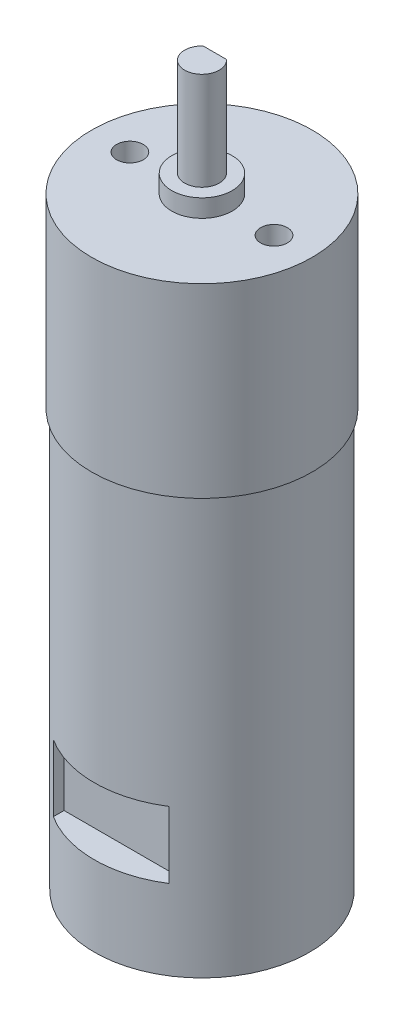
ISO-10303-21;
HEADER;
FILE_DESCRIPTION(('STEP AP214'),'2;1');
FILE_NAME('part.step','',(''),(''),'','','');
FILE_SCHEMA(('AUTOMOTIVE_DESIGN { 1 0 10303 214 1 1 1 1 }'));
ENDSEC;
DATA;
#1=APPLICATION_CONTEXT('core data for automotive mechanical design processes');
#2=APPLICATION_PROTOCOL_DEFINITION('international standard','automotive_design',2000,#1);
#3=PRODUCT_CONTEXT('',#1,'mechanical');
#4=PRODUCT('Part','Part','',(#3));
#5=PRODUCT_RELATED_PRODUCT_CATEGORY('part','',(#4));
#6=PRODUCT_DEFINITION_FORMATION('','',#4);
#7=PRODUCT_DEFINITION_CONTEXT('part definition',#1,'design');
#8=PRODUCT_DEFINITION('design','',#6,#7);
#9=PRODUCT_DEFINITION_SHAPE('','',#8);
#10=(LENGTH_UNIT() NAMED_UNIT(*) SI_UNIT(.MILLI.,.METRE.));
#11=(NAMED_UNIT(*) PLANE_ANGLE_UNIT() SI_UNIT($,.RADIAN.));
#12=(NAMED_UNIT(*) SI_UNIT($,.STERADIAN.) SOLID_ANGLE_UNIT());
#13=UNCERTAINTY_MEASURE_WITH_UNIT(LENGTH_MEASURE(1.E-05),#10,'distance_accuracy_value','');
#14=(GEOMETRIC_REPRESENTATION_CONTEXT(3) GLOBAL_UNCERTAINTY_ASSIGNED_CONTEXT((#13)) GLOBAL_UNIT_ASSIGNED_CONTEXT((#10,
#11,#12)) REPRESENTATION_CONTEXT('',''));
#15=CARTESIAN_POINT('',(0.,0.,0.));
#16=DIRECTION('',(0.,0.,1.));
#17=DIRECTION('',(1.,0.,0.));
#18=AXIS2_PLACEMENT_3D('',#15,#16,#17);
#19=CARTESIAN_POINT('',(0.,20.9,0.));
#20=DIRECTION('',(0.,-1.,0.));
#21=DIRECTION('',(0.,0.,-1.));
#22=AXIS2_PLACEMENT_3D('',#19,#20,#21);
#23=CYLINDRICAL_SURFACE('',#22,12.4);
#24=CARTESIAN_POINT('',(0.,20.9,0.));
#25=DIRECTION('',(0.,1.,0.));
#26=DIRECTION('',(0.,0.,1.));
#27=AXIS2_PLACEMENT_3D('',#24,#25,#26);
#28=CIRCLE('',#27,12.4);
#29=CARTESIAN_POINT('',(0.,20.9,12.4));
#30=VERTEX_POINT('',#29);
#31=EDGE_CURVE('E187',#30,#30,#28,.T.);
#32=ORIENTED_EDGE('',*,*,#31,.F.);
#33=EDGE_LOOP('',(#32));
#34=FACE_BOUND('',#33,.T.);
#35=CARTESIAN_POINT('',(0.,0.,0.));
#36=DIRECTION('',(0.,1.,0.));
#37=DIRECTION('',(0.,0.,1.));
#38=AXIS2_PLACEMENT_3D('',#35,#36,#37);
#39=CIRCLE('',#38,12.4);
#40=CARTESIAN_POINT('',(0.,0.,12.4));
#41=VERTEX_POINT('',#40);
#42=EDGE_CURVE('E183',#41,#41,#39,.T.);
#43=ORIENTED_EDGE('',*,*,#42,.T.);
#44=EDGE_LOOP('',(#43));
#45=FACE_BOUND('',#44,.T.);
#46=ADVANCED_FACE('F42',(#34,#45),#23,.T.);
#47=CARTESIAN_POINT('',(0.,20.9,0.));
#48=DIRECTION('',(0.,1.,0.));
#49=DIRECTION('',(0.,0.,1.));
#50=AXIS2_PLACEMENT_3D('',#47,#48,#49);
#51=PLANE('',#50);
#52=CARTESIAN_POINT('',(-8.1,20.9,0.));
#53=DIRECTION('',(0.,1.,0.));
#54=DIRECTION('',(0.,0.,1.));
#55=AXIS2_PLACEMENT_3D('',#52,#53,#54);
#56=CIRCLE('',#55,1.5);
#57=CARTESIAN_POINT('',(-8.1,20.9,1.5));
#58=VERTEX_POINT('',#57);
#59=EDGE_CURVE('E139',#58,#58,#56,.T.);
#60=ORIENTED_EDGE('',*,*,#59,.F.);
#61=EDGE_LOOP('',(#60));
#62=FACE_BOUND('',#61,.T.);
#63=CARTESIAN_POINT('',(8.1,20.9,0.));
#64=DIRECTION('',(0.,1.,0.));
#65=DIRECTION('',(0.,0.,-1.));
#66=AXIS2_PLACEMENT_3D('',#63,#64,#65);
#67=CIRCLE('',#66,1.5);
#68=CARTESIAN_POINT('',(8.1,20.9,-1.5));
#69=VERTEX_POINT('',#68);
#70=EDGE_CURVE('E143',#69,#69,#67,.T.);
#71=ORIENTED_EDGE('',*,*,#70,.F.);
#72=EDGE_LOOP('',(#71));
#73=FACE_BOUND('',#72,.T.);
#74=CARTESIAN_POINT('',(0.,20.9,0.));
#75=DIRECTION('',(0.,1.,0.));
#76=DIRECTION('',(0.,0.,1.));
#77=AXIS2_PLACEMENT_3D('',#74,#75,#76);
#78=CIRCLE('',#77,3.4);
#79=CARTESIAN_POINT('',(0.,20.9,3.4));
#80=VERTEX_POINT('',#79);
#81=EDGE_CURVE('E179',#80,#80,#78,.T.);
#82=ORIENTED_EDGE('',*,*,#81,.F.);
#83=EDGE_LOOP('',(#82));
#84=FACE_BOUND('',#83,.T.);
#85=ORIENTED_EDGE('',*,*,#31,.T.);
#86=EDGE_LOOP('',(#85));
#87=FACE_BOUND('',#86,.T.);
#88=ADVANCED_FACE('F222',(#62,#73,#84,#87),#51,.T.);
#89=CARTESIAN_POINT('',(0.,0.,0.));
#90=DIRECTION('',(0.,1.,0.));
#91=DIRECTION('',(0.,0.,1.));
#92=AXIS2_PLACEMENT_3D('',#89,#90,#91);
#93=PLANE('',#92);
#94=CARTESIAN_POINT('',(0.,0.,0.));
#95=DIRECTION('',(0.,-1.,0.));
#96=DIRECTION('',(0.,0.,-1.));
#97=AXIS2_PLACEMENT_3D('',#94,#95,#96);
#98=CIRCLE('',#97,12.1);
#99=CARTESIAN_POINT('',(0.,0.,-12.1));
#100=VERTEX_POINT('',#99);
#101=EDGE_CURVE('E154',#100,#100,#98,.T.);
#102=ORIENTED_EDGE('',*,*,#101,.F.);
#103=EDGE_LOOP('',(#102));
#104=FACE_BOUND('',#103,.T.);
#105=ORIENTED_EDGE('',*,*,#42,.F.);
#106=EDGE_LOOP('',(#105));
#107=FACE_BOUND('',#106,.T.);
#108=ADVANCED_FACE('F228',(#104,#107),#93,.F.);
#109=CARTESIAN_POINT('',(0.,22.9,0.));
#110=DIRECTION('',(0.,-1.,0.));
#111=DIRECTION('',(0.,0.,-1.));
#112=AXIS2_PLACEMENT_3D('',#109,#110,#111);
#113=CYLINDRICAL_SURFACE('',#112,3.4);
#114=CARTESIAN_POINT('',(0.,22.9,0.));
#115=DIRECTION('',(0.,1.,0.));
#116=DIRECTION('',(0.,0.,1.));
#117=AXIS2_PLACEMENT_3D('',#114,#115,#116);
#118=CIRCLE('',#117,3.4);
#119=CARTESIAN_POINT('',(0.,22.9,3.4));
#120=VERTEX_POINT('',#119);
#121=EDGE_CURVE('E173',#120,#120,#118,.T.);
#122=ORIENTED_EDGE('',*,*,#121,.F.);
#123=EDGE_LOOP('',(#122));
#124=FACE_BOUND('',#123,.T.);
#125=ORIENTED_EDGE('',*,*,#81,.T.);
#126=EDGE_LOOP('',(#125));
#127=FACE_BOUND('',#126,.T.);
#128=ADVANCED_FACE('F236',(#124,#127),#113,.T.);
#129=CARTESIAN_POINT('',(0.,22.9,0.));
#130=DIRECTION('',(0.,1.,0.));
#131=DIRECTION('',(0.,0.,1.));
#132=AXIS2_PLACEMENT_3D('',#129,#130,#131);
#133=PLANE('',#132);
#134=CARTESIAN_POINT('',(0.,22.9,0.));
#135=DIRECTION('',(0.,1.,0.));
#136=DIRECTION('',(0.,0.,1.));
#137=AXIS2_PLACEMENT_3D('',#134,#135,#136);
#138=CIRCLE('',#137,1.95);
#139=CARTESIAN_POINT('',(0.,22.9,1.95));
#140=VERTEX_POINT('',#139);
#141=EDGE_CURVE('E174',#140,#140,#138,.T.);
#142=ORIENTED_EDGE('',*,*,#141,.F.);
#143=EDGE_LOOP('',(#142));
#144=FACE_BOUND('',#143,.T.);
#145=ORIENTED_EDGE('',*,*,#121,.T.);
#146=EDGE_LOOP('',(#145));
#147=FACE_BOUND('',#146,.T.);
#148=ADVANCED_FACE('F241',(#144,#147),#133,.T.);
#149=CARTESIAN_POINT('',(0.,33.9,0.));
#150=DIRECTION('',(0.,-1.,0.));
#151=DIRECTION('',(0.,0.,-1.));
#152=AXIS2_PLACEMENT_3D('',#149,#150,#151);
#153=CYLINDRICAL_SURFACE('',#152,1.95);
#154=CARTESIAN_POINT('',(0.,33.9,0.));
#155=DIRECTION('',(0.,1.,0.));
#156=DIRECTION('',(0.,0.,1.));
#157=AXIS2_PLACEMENT_3D('',#154,#155,#156);
#158=CIRCLE('',#157,1.95);
#159=CARTESIAN_POINT('',(-1.30384048104053,33.9,-1.45));
#160=VERTEX_POINT('',#159);
#161=CARTESIAN_POINT('',(1.30384048104053,33.9,-1.45));
#162=VERTEX_POINT('',#161);
#163=EDGE_CURVE('E169',#160,#162,#158,.T.);
#164=ORIENTED_EDGE('',*,*,#163,.F.);
#165=DIRECTION('',(0.,-1.,0.));
#166=VECTOR('',#165,1.);
#167=CARTESIAN_POINT('',(-1.30384048104053,33.9,-1.45));
#168=LINE('',#167,#166);
#169=CARTESIAN_POINT('',(-1.30384048104053,23.9,-1.45));
#170=VERTEX_POINT('',#169);
#171=EDGE_CURVE('E65',#160,#170,#168,.T.);
#172=ORIENTED_EDGE('',*,*,#171,.T.);
#173=CARTESIAN_POINT('',(0.,23.9,0.));
#174=DIRECTION('',(0.,-1.,0.));
#175=DIRECTION('',(0.,0.,-1.));
#176=AXIS2_PLACEMENT_3D('',#173,#174,#175);
#177=CIRCLE('',#176,1.95);
#178=CARTESIAN_POINT('',(1.30384048104053,23.9,-1.45));
#179=VERTEX_POINT('',#178);
#180=EDGE_CURVE('E159',#170,#179,#177,.T.);
#181=ORIENTED_EDGE('',*,*,#180,.T.);
#182=DIRECTION('',(0.,-1.,0.));
#183=VECTOR('',#182,1.);
#184=CARTESIAN_POINT('',(1.30384048104053,33.9,-1.45));
#185=LINE('',#184,#183);
#186=EDGE_CURVE('E163',#179,#162,#185,.F.);
#187=ORIENTED_EDGE('',*,*,#186,.T.);
#188=EDGE_LOOP('',(#164,#172,#181,#187));
#189=FACE_BOUND('',#188,.T.);
#190=ORIENTED_EDGE('',*,*,#141,.T.);
#191=EDGE_LOOP('',(#190));
#192=FACE_BOUND('',#191,.T.);
#193=ADVANCED_FACE('F248',(#189,#192),#153,.T.);
#194=CARTESIAN_POINT('',(0.,33.9,0.));
#195=DIRECTION('',(0.,1.,0.));
#196=DIRECTION('',(0.,0.,1.));
#197=AXIS2_PLACEMENT_3D('',#194,#195,#196);
#198=PLANE('',#197);
#199=DIRECTION('',(1.,0.,0.));
#200=VECTOR('',#199,1.);
#201=CARTESIAN_POINT('',(0.,33.9,-1.45));
#202=LINE('',#201,#200);
#203=EDGE_CURVE('E178',#160,#162,#202,.T.);
#204=ORIENTED_EDGE('',*,*,#203,.F.);
#205=ORIENTED_EDGE('',*,*,#163,.T.);
#206=EDGE_LOOP('',(#204,#205));
#207=FACE_BOUND('',#206,.T.);
#208=ADVANCED_FACE('F252',(#207),#198,.T.);
#209=CARTESIAN_POINT('',(0.,23.9,0.));
#210=DIRECTION('',(0.,-1.,0.));
#211=DIRECTION('',(0.,0.,-1.));
#212=AXIS2_PLACEMENT_3D('',#209,#210,#211);
#213=PLANE('',#212);
#214=DIRECTION('',(1.,0.,0.));
#215=VECTOR('',#214,1.);
#216=CARTESIAN_POINT('',(1.84486384252448,23.9,-1.45));
#217=LINE('',#216,#215);
#218=EDGE_CURVE('E153',#170,#179,#217,.T.);
#219=ORIENTED_EDGE('',*,*,#218,.T.);
#220=ORIENTED_EDGE('',*,*,#180,.F.);
#221=EDGE_LOOP('',(#219,#220));
#222=FACE_BOUND('',#221,.T.);
#223=ADVANCED_FACE('F256',(#222),#213,.F.);
#224=CARTESIAN_POINT('',(0.,23.9,-1.45));
#225=DIRECTION('',(0.,0.,1.));
#226=DIRECTION('',(1.,0.,0.));
#227=AXIS2_PLACEMENT_3D('',#224,#225,#226);
#228=PLANE('',#227);
#229=ORIENTED_EDGE('',*,*,#203,.T.);
#230=ORIENTED_EDGE('',*,*,#186,.F.);
#231=ORIENTED_EDGE('',*,*,#218,.F.);
#232=ORIENTED_EDGE('',*,*,#171,.F.);
#233=EDGE_LOOP('',(#229,#230,#231,#232));
#234=FACE_BOUND('',#233,.T.);
#235=ADVANCED_FACE('F258',(#234),#228,.F.);
#236=CARTESIAN_POINT('',(0.,-46.9,0.));
#237=DIRECTION('',(0.,1.,0.));
#238=DIRECTION('',(0.,0.,1.));
#239=AXIS2_PLACEMENT_3D('',#236,#237,#238);
#240=CYLINDRICAL_SURFACE('',#239,12.1);
#241=CARTESIAN_POINT('',(0.,-37.9,0.));
#242=DIRECTION('',(0.,-1.,0.));
#243=DIRECTION('',(0.,0.,-1.));
#244=AXIS2_PLACEMENT_3D('',#241,#242,#243);
#245=CIRCLE('',#244,12.1);
#246=CARTESIAN_POINT('',(6.5,-37.9,10.2058806577385));
#247=VERTEX_POINT('',#246);
#248=CARTESIAN_POINT('',(-6.5,-37.9,10.2058806577385));
#249=VERTEX_POINT('',#248);
#250=EDGE_CURVE('E158',#247,#249,#245,.T.);
#251=ORIENTED_EDGE('',*,*,#250,.T.);
#252=DIRECTION('',(0.,1.,0.));
#253=VECTOR('',#252,1.);
#254=CARTESIAN_POINT('',(-6.5,-46.9,10.2058806577385));
#255=LINE('',#254,#253);
#256=CARTESIAN_POINT('',(-6.5,-30.4,10.2058806577385));
#257=VERTEX_POINT('',#256);
#258=EDGE_CURVE('E11',#249,#257,#255,.T.);
#259=ORIENTED_EDGE('',*,*,#258,.T.);
#260=CARTESIAN_POINT('',(0.,-30.4,0.));
#261=DIRECTION('',(0.,1.,0.));
#262=DIRECTION('',(0.,0.,1.));
#263=AXIS2_PLACEMENT_3D('',#260,#261,#262);
#264=CIRCLE('',#263,12.1);
#265=CARTESIAN_POINT('',(6.5,-30.4,10.2058806577385));
#266=VERTEX_POINT('',#265);
#267=EDGE_CURVE('E50',#257,#266,#264,.T.);
#268=ORIENTED_EDGE('',*,*,#267,.T.);
#269=DIRECTION('',(0.,1.,0.));
#270=VECTOR('',#269,1.);
#271=CARTESIAN_POINT('',(6.5,-46.9,10.2058806577385));
#272=LINE('',#271,#270);
#273=EDGE_CURVE('E201',#266,#247,#272,.F.);
#274=ORIENTED_EDGE('',*,*,#273,.T.);
#275=EDGE_LOOP('',(#251,#259,#268,#274));
#276=FACE_BOUND('',#275,.T.);
#277=CARTESIAN_POINT('',(0.,-46.9,0.));
#278=DIRECTION('',(0.,-1.,0.));
#279=DIRECTION('',(0.,0.,-1.));
#280=AXIS2_PLACEMENT_3D('',#277,#278,#279);
#281=CIRCLE('',#280,12.1);
#282=CARTESIAN_POINT('',(0.,-46.9,-12.1));
#283=VERTEX_POINT('',#282);
#284=EDGE_CURVE('E138',#283,#283,#281,.T.);
#285=ORIENTED_EDGE('',*,*,#284,.F.);
#286=EDGE_LOOP('',(#285));
#287=FACE_BOUND('',#286,.T.);
#288=ORIENTED_EDGE('',*,*,#101,.T.);
#289=EDGE_LOOP('',(#288));
#290=FACE_BOUND('',#289,.T.);
#291=ADVANCED_FACE('F207',(#276,#287,#290),#240,.T.);
#292=CARTESIAN_POINT('',(0.,-46.9,0.));
#293=DIRECTION('',(0.,-1.,0.));
#294=DIRECTION('',(0.,0.,-1.));
#295=AXIS2_PLACEMENT_3D('',#292,#293,#294);
#296=PLANE('',#295);
#297=ORIENTED_EDGE('',*,*,#284,.T.);
#298=EDGE_LOOP('',(#297));
#299=FACE_BOUND('',#298,.T.);
#300=ADVANCED_FACE('F266',(#299),#296,.T.);
#301=CARTESIAN_POINT('',(8.1,15.9,0.));
#302=DIRECTION('',(0.,1.,0.));
#303=DIRECTION('',(0.,0.,1.));
#304=AXIS2_PLACEMENT_3D('',#301,#302,#303);
#305=CYLINDRICAL_SURFACE('',#304,1.5);
#306=CARTESIAN_POINT('',(8.1,15.9,0.));
#307=DIRECTION('',(0.,1.,0.));
#308=DIRECTION('',(0.,0.,-1.));
#309=AXIS2_PLACEMENT_3D('',#306,#307,#308);
#310=CIRCLE('',#309,1.5);
#311=CARTESIAN_POINT('',(8.1,15.9,-1.5));
#312=VERTEX_POINT('',#311);
#313=EDGE_CURVE('E127',#312,#312,#310,.T.);
#314=ORIENTED_EDGE('',*,*,#313,.F.);
#315=EDGE_LOOP('',(#314));
#316=FACE_BOUND('',#315,.T.);
#317=ORIENTED_EDGE('',*,*,#70,.T.);
#318=EDGE_LOOP('',(#317));
#319=FACE_BOUND('',#318,.T.);
#320=ADVANCED_FACE('F269',(#316,#319),#305,.F.);
#321=CARTESIAN_POINT('',(8.1,15.9,0.));
#322=DIRECTION('',(0.,-1.,0.));
#323=DIRECTION('',(0.,0.,-1.));
#324=AXIS2_PLACEMENT_3D('',#321,#322,#323);
#325=PLANE('',#324);
#326=ORIENTED_EDGE('',*,*,#313,.T.);
#327=EDGE_LOOP('',(#326));
#328=FACE_BOUND('',#327,.T.);
#329=ADVANCED_FACE('F271',(#328),#325,.F.);
#330=CARTESIAN_POINT('',(-8.1,15.9,0.));
#331=DIRECTION('',(0.,1.,0.));
#332=DIRECTION('',(0.,0.,1.));
#333=AXIS2_PLACEMENT_3D('',#330,#331,#332);
#334=CYLINDRICAL_SURFACE('',#333,1.5);
#335=CARTESIAN_POINT('',(-8.1,15.9,0.));
#336=DIRECTION('',(0.,1.,0.));
#337=DIRECTION('',(0.,0.,1.));
#338=AXIS2_PLACEMENT_3D('',#335,#336,#337);
#339=CIRCLE('',#338,1.5);
#340=CARTESIAN_POINT('',(-8.1,15.9,1.5));
#341=VERTEX_POINT('',#340);
#342=EDGE_CURVE('E134',#341,#341,#339,.T.);
#343=ORIENTED_EDGE('',*,*,#342,.F.);
#344=EDGE_LOOP('',(#343));
#345=FACE_BOUND('',#344,.T.);
#346=ORIENTED_EDGE('',*,*,#59,.T.);
#347=EDGE_LOOP('',(#346));
#348=FACE_BOUND('',#347,.T.);
#349=ADVANCED_FACE('F274',(#345,#348),#334,.F.);
#350=CARTESIAN_POINT('',(-8.1,15.9,0.));
#351=DIRECTION('',(0.,1.,0.));
#352=DIRECTION('',(0.,0.,1.));
#353=AXIS2_PLACEMENT_3D('',#350,#351,#352);
#354=PLANE('',#353);
#355=ORIENTED_EDGE('',*,*,#342,.T.);
#356=EDGE_LOOP('',(#355));
#357=FACE_BOUND('',#356,.T.);
#358=ADVANCED_FACE('F281',(#357),#354,.T.);
#359=CARTESIAN_POINT('',(-6.5,-30.4,9.));
#360=DIRECTION('',(-1.,0.,0.));
#361=DIRECTION('',(0.,0.,1.));
#362=AXIS2_PLACEMENT_3D('',#359,#360,#361);
#363=PLANE('',#362);
#364=DIRECTION('',(0.,0.,1.));
#365=VECTOR('',#364,1.);
#366=CARTESIAN_POINT('',(-6.5,-37.9,9.));
#367=LINE('',#366,#365);
#368=CARTESIAN_POINT('',(-6.5,-37.9,9.));
#369=VERTEX_POINT('',#368);
#370=EDGE_CURVE('E57',#369,#249,#367,.T.);
#371=ORIENTED_EDGE('',*,*,#370,.F.);
#372=DIRECTION('',(0.,-1.,0.));
#373=VECTOR('',#372,1.);
#374=CARTESIAN_POINT('',(-6.5,-30.4,9.));
#375=LINE('',#374,#373);
#376=CARTESIAN_POINT('',(-6.5,-30.4,9.));
#377=VERTEX_POINT('',#376);
#378=EDGE_CURVE('E98',#377,#369,#375,.T.);
#379=ORIENTED_EDGE('',*,*,#378,.F.);
#380=DIRECTION('',(0.,0.,1.));
#381=VECTOR('',#380,1.);
#382=CARTESIAN_POINT('',(-6.5,-30.4,9.));
#383=LINE('',#382,#381);
#384=EDGE_CURVE('E124',#377,#257,#383,.T.);
#385=ORIENTED_EDGE('',*,*,#384,.T.);
#386=ORIENTED_EDGE('',*,*,#258,.F.);
#387=EDGE_LOOP('',(#371,#379,#385,#386));
#388=FACE_BOUND('',#387,.T.);
#389=ADVANCED_FACE('F95',(#388),#363,.F.);
#390=CARTESIAN_POINT('',(-6.5,-30.4,9.));
#391=DIRECTION('',(0.,1.,0.));
#392=DIRECTION('',(0.,0.,1.));
#393=AXIS2_PLACEMENT_3D('',#390,#391,#392);
#394=PLANE('',#393);
#395=ORIENTED_EDGE('',*,*,#384,.F.);
#396=DIRECTION('',(-1.,0.,0.));
#397=VECTOR('',#396,1.);
#398=CARTESIAN_POINT('',(-6.5,-30.4,9.));
#399=LINE('',#398,#397);
#400=CARTESIAN_POINT('',(6.5,-30.4,9.));
#401=VERTEX_POINT('',#400);
#402=EDGE_CURVE('E103',#401,#377,#399,.T.);
#403=ORIENTED_EDGE('',*,*,#402,.F.);
#404=DIRECTION('',(0.,0.,1.));
#405=VECTOR('',#404,1.);
#406=CARTESIAN_POINT('',(6.5,-30.4,9.));
#407=LINE('',#406,#405);
#408=EDGE_CURVE('E128',#401,#266,#407,.T.);
#409=ORIENTED_EDGE('',*,*,#408,.T.);
#410=ORIENTED_EDGE('',*,*,#267,.F.);
#411=EDGE_LOOP('',(#395,#403,#409,#410));
#412=FACE_BOUND('',#411,.T.);
#413=ADVANCED_FACE('F210',(#412),#394,.F.);
#414=CARTESIAN_POINT('',(6.5,-30.4,9.));
#415=DIRECTION('',(1.,0.,0.));
#416=DIRECTION('',(0.,0.,-1.));
#417=AXIS2_PLACEMENT_3D('',#414,#415,#416);
#418=PLANE('',#417);
#419=ORIENTED_EDGE('',*,*,#408,.F.);
#420=DIRECTION('',(0.,1.,0.));
#421=VECTOR('',#420,1.);
#422=CARTESIAN_POINT('',(6.5,-30.4,9.));
#423=LINE('',#422,#421);
#424=CARTESIAN_POINT('',(6.5,-37.9,9.));
#425=VERTEX_POINT('',#424);
#426=EDGE_CURVE('E113',#425,#401,#423,.T.);
#427=ORIENTED_EDGE('',*,*,#426,.F.);
#428=DIRECTION('',(0.,0.,1.));
#429=VECTOR('',#428,1.);
#430=CARTESIAN_POINT('',(6.5,-37.9,9.));
#431=LINE('',#430,#429);
#432=EDGE_CURVE('E102',#425,#247,#431,.T.);
#433=ORIENTED_EDGE('',*,*,#432,.T.);
#434=ORIENTED_EDGE('',*,*,#273,.F.);
#435=EDGE_LOOP('',(#419,#427,#433,#434));
#436=FACE_BOUND('',#435,.T.);
#437=ADVANCED_FACE('F212',(#436),#418,.F.);
#438=CARTESIAN_POINT('',(-6.5,-37.9,9.));
#439=DIRECTION('',(0.,-1.,0.));
#440=DIRECTION('',(0.,0.,-1.));
#441=AXIS2_PLACEMENT_3D('',#438,#439,#440);
#442=PLANE('',#441);
#443=ORIENTED_EDGE('',*,*,#432,.F.);
#444=DIRECTION('',(1.,0.,0.));
#445=VECTOR('',#444,1.);
#446=CARTESIAN_POINT('',(-6.5,-37.9,9.));
#447=LINE('',#446,#445);
#448=EDGE_CURVE('E106',#369,#425,#447,.T.);
#449=ORIENTED_EDGE('',*,*,#448,.F.);
#450=ORIENTED_EDGE('',*,*,#370,.T.);
#451=ORIENTED_EDGE('',*,*,#250,.F.);
#452=EDGE_LOOP('',(#443,#449,#450,#451));
#453=FACE_BOUND('',#452,.T.);
#454=ADVANCED_FACE('F107',(#453),#442,.F.);
#455=CARTESIAN_POINT('',(0.,0.,9.));
#456=DIRECTION('',(0.,0.,1.));
#457=DIRECTION('',(1.,0.,0.));
#458=AXIS2_PLACEMENT_3D('',#455,#456,#457);
#459=PLANE('',#458);
#460=ORIENTED_EDGE('',*,*,#378,.T.);
#461=ORIENTED_EDGE('',*,*,#448,.T.);
#462=ORIENTED_EDGE('',*,*,#426,.T.);
#463=ORIENTED_EDGE('',*,*,#402,.T.);
#464=EDGE_LOOP('',(#460,#461,#462,#463));
#465=FACE_BOUND('',#464,.T.);
#466=ADVANCED_FACE('F115',(#465),#459,.T.);
#467=CLOSED_SHELL('',(#46,#88,#108,#128,#148,#193,#208,#223,#235,#291,#300,#320,#329,#349,#358,
#389,#413,#437,#454,#466));
#468=MANIFOLD_SOLID_BREP('B2',#467);
#469=ADVANCED_BREP_SHAPE_REPRESENTATION('',(#18,#468),#14);
#470=SHAPE_DEFINITION_REPRESENTATION(#9,#469);
ENDSEC;
END-ISO-10303-21;
